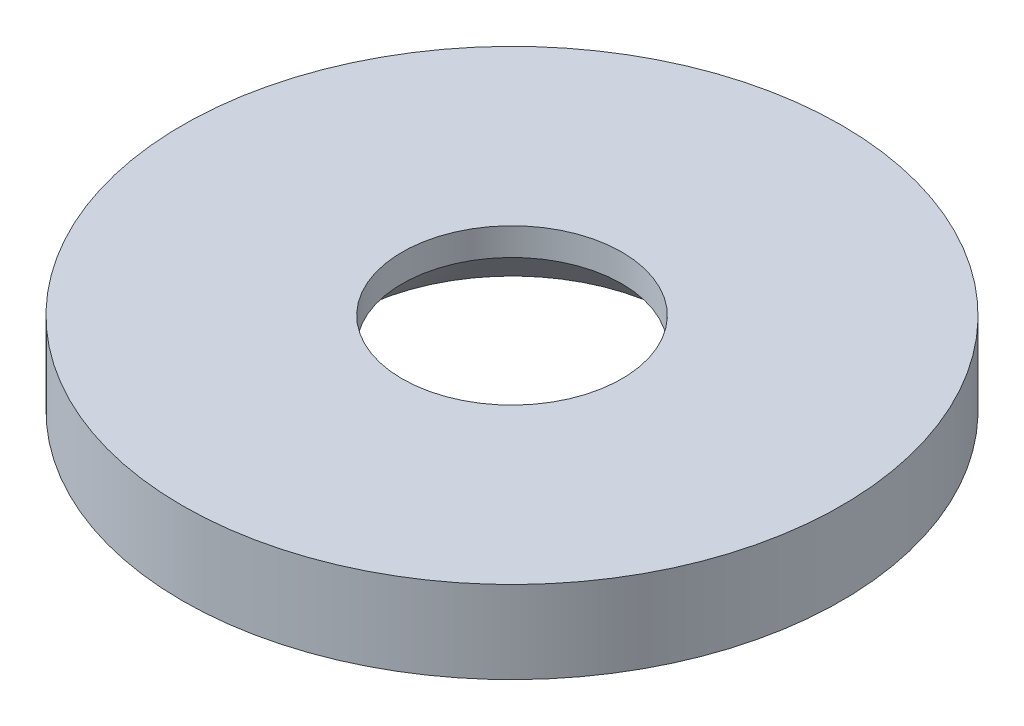
ISO-10303-21;
HEADER;
FILE_DESCRIPTION(('STEP AP214'),'2;1');
FILE_NAME('part.step','',(''),(''),'','','');
FILE_SCHEMA(('AUTOMOTIVE_DESIGN { 1 0 10303 214 1 1 1 1 }'));
ENDSEC;
DATA;
#1=APPLICATION_CONTEXT('core data for automotive mechanical design processes');
#2=APPLICATION_PROTOCOL_DEFINITION('international standard','automotive_design',2000,#1);
#3=PRODUCT_CONTEXT('',#1,'mechanical');
#4=PRODUCT('Part','Part','',(#3));
#5=PRODUCT_RELATED_PRODUCT_CATEGORY('part','',(#4));
#6=PRODUCT_DEFINITION_FORMATION('','',#4);
#7=PRODUCT_DEFINITION_CONTEXT('part definition',#1,'design');
#8=PRODUCT_DEFINITION('design','',#6,#7);
#9=PRODUCT_DEFINITION_SHAPE('','',#8);
#10=(LENGTH_UNIT() NAMED_UNIT(*) SI_UNIT(.MILLI.,.METRE.));
#11=(NAMED_UNIT(*) PLANE_ANGLE_UNIT() SI_UNIT($,.RADIAN.));
#12=(NAMED_UNIT(*) SI_UNIT($,.STERADIAN.) SOLID_ANGLE_UNIT());
#13=UNCERTAINTY_MEASURE_WITH_UNIT(LENGTH_MEASURE(1.E-05),#10,'distance_accuracy_value','');
#14=(GEOMETRIC_REPRESENTATION_CONTEXT(3) GLOBAL_UNCERTAINTY_ASSIGNED_CONTEXT((#13)) GLOBAL_UNIT_ASSIGNED_CONTEXT((#10,
#11,#12)) REPRESENTATION_CONTEXT('',''));
#15=CARTESIAN_POINT('',(0.,0.,0.));
#16=DIRECTION('',(0.,0.,1.));
#17=DIRECTION('',(1.,0.,0.));
#18=AXIS2_PLACEMENT_3D('',#15,#16,#17);
#19=CARTESIAN_POINT('',(0.,1.5,0.));
#20=DIRECTION('',(0.,1.,0.));
#21=DIRECTION('',(0.,0.,1.));
#22=AXIS2_PLACEMENT_3D('',#19,#20,#21);
#23=PLANE('',#22);
#24=CARTESIAN_POINT('',(0.,1.5,0.));
#25=DIRECTION('',(0.,1.,0.));
#26=DIRECTION('',(0.,0.,1.));
#27=AXIS2_PLACEMENT_3D('',#24,#25,#26);
#28=CIRCLE('',#27,6.);
#29=CARTESIAN_POINT('',(0.,1.5,6.));
#30=VERTEX_POINT('',#29);
#31=EDGE_CURVE('E44',#30,#30,#28,.T.);
#32=ORIENTED_EDGE('',*,*,#31,.T.);
#33=EDGE_LOOP('',(#32));
#34=FACE_BOUND('',#33,.T.);
#35=CARTESIAN_POINT('',(0.,1.5,0.));
#36=DIRECTION('',(0.,1.,0.));
#37=DIRECTION('',(0.,0.,1.));
#38=AXIS2_PLACEMENT_3D('',#35,#36,#37);
#39=CIRCLE('',#38,2.);
#40=CARTESIAN_POINT('',(0.,1.5,2.));
#41=VERTEX_POINT('',#40);
#42=EDGE_CURVE('E52',#41,#41,#39,.T.);
#43=ORIENTED_EDGE('',*,*,#42,.F.);
#44=EDGE_LOOP('',(#43));
#45=FACE_BOUND('',#44,.T.);
#46=ADVANCED_FACE('F33',(#34,#45),#23,.T.);
#47=CARTESIAN_POINT('',(0.,0.,0.));
#48=DIRECTION('',(0.,1.,0.));
#49=DIRECTION('',(0.,0.,1.));
#50=AXIS2_PLACEMENT_3D('',#47,#48,#49);
#51=PLANE('',#50);
#52=CARTESIAN_POINT('',(0.,0.,0.));
#53=DIRECTION('',(0.,1.,0.));
#54=DIRECTION('',(0.,0.,1.));
#55=AXIS2_PLACEMENT_3D('',#52,#53,#54);
#56=CIRCLE('',#55,3.);
#57=CARTESIAN_POINT('',(0.,0.,3.));
#58=VERTEX_POINT('',#57);
#59=EDGE_CURVE('E40',#58,#58,#56,.T.);
#60=ORIENTED_EDGE('',*,*,#59,.T.);
#61=EDGE_LOOP('',(#60));
#62=FACE_BOUND('',#61,.T.);
#63=CARTESIAN_POINT('',(0.,0.,0.));
#64=DIRECTION('',(0.,1.,0.));
#65=DIRECTION('',(0.,0.,1.));
#66=AXIS2_PLACEMENT_3D('',#63,#64,#65);
#67=CIRCLE('',#66,6.);
#68=CARTESIAN_POINT('',(0.,0.,6.));
#69=VERTEX_POINT('',#68);
#70=EDGE_CURVE('E48',#69,#69,#67,.T.);
#71=ORIENTED_EDGE('',*,*,#70,.F.);
#72=EDGE_LOOP('',(#71));
#73=FACE_BOUND('',#72,.T.);
#74=ADVANCED_FACE('F60',(#62,#73),#51,.F.);
#75=CARTESIAN_POINT('',(0.,1.5,0.));
#76=DIRECTION('',(0.,-1.,0.));
#77=DIRECTION('',(0.,0.,-1.));
#78=AXIS2_PLACEMENT_3D('',#75,#76,#77);
#79=CYLINDRICAL_SURFACE('',#78,6.);
#80=ORIENTED_EDGE('',*,*,#31,.F.);
#81=EDGE_LOOP('',(#80));
#82=FACE_BOUND('',#81,.T.);
#83=ORIENTED_EDGE('',*,*,#70,.T.);
#84=EDGE_LOOP('',(#83));
#85=FACE_BOUND('',#84,.T.);
#86=ADVANCED_FACE('F66',(#82,#85),#79,.T.);
#87=CARTESIAN_POINT('',(0.,1.5,0.));
#88=DIRECTION('',(0.,-1.,0.));
#89=DIRECTION('',(0.,0.,-1.));
#90=AXIS2_PLACEMENT_3D('',#87,#88,#89);
#91=CYLINDRICAL_SURFACE('',#90,2.);
#92=CARTESIAN_POINT('',(0.,1.,0.));
#93=DIRECTION('',(0.,1.,0.));
#94=DIRECTION('',(0.,0.,1.));
#95=AXIS2_PLACEMENT_3D('',#92,#93,#94);
#96=CIRCLE('',#95,2.);
#97=CARTESIAN_POINT('',(0.,1.,2.));
#98=VERTEX_POINT('',#97);
#99=EDGE_CURVE('E10',#98,#98,#96,.F.);
#100=ORIENTED_EDGE('',*,*,#99,.T.);
#101=EDGE_LOOP('',(#100));
#102=FACE_BOUND('',#101,.T.);
#103=ORIENTED_EDGE('',*,*,#42,.T.);
#104=EDGE_LOOP('',(#103));
#105=FACE_BOUND('',#104,.T.);
#106=ADVANCED_FACE('F57',(#102,#105),#91,.F.);
#107=CARTESIAN_POINT('',(0.,0.,0.));
#108=DIRECTION('',(0.,-1.,0.));
#109=DIRECTION('',(0.,0.,-1.));
#110=AXIS2_PLACEMENT_3D('',#107,#108,#109);
#111=CONICAL_SURFACE('',#110,3.,0.785398163397447);
#112=ORIENTED_EDGE('',*,*,#99,.F.);
#113=EDGE_LOOP('',(#112));
#114=FACE_BOUND('',#113,.T.);
#115=ORIENTED_EDGE('',*,*,#59,.F.);
#116=EDGE_LOOP('',(#115));
#117=FACE_BOUND('',#116,.T.);
#118=ADVANCED_FACE('F35',(#114,#117),#111,.F.);
#119=CLOSED_SHELL('',(#46,#74,#86,#106,#118));
#120=MANIFOLD_SOLID_BREP('B2',#119);
#121=ADVANCED_BREP_SHAPE_REPRESENTATION('',(#18,#120),#14);
#122=SHAPE_DEFINITION_REPRESENTATION(#9,#121);
ENDSEC;
END-ISO-10303-21;
